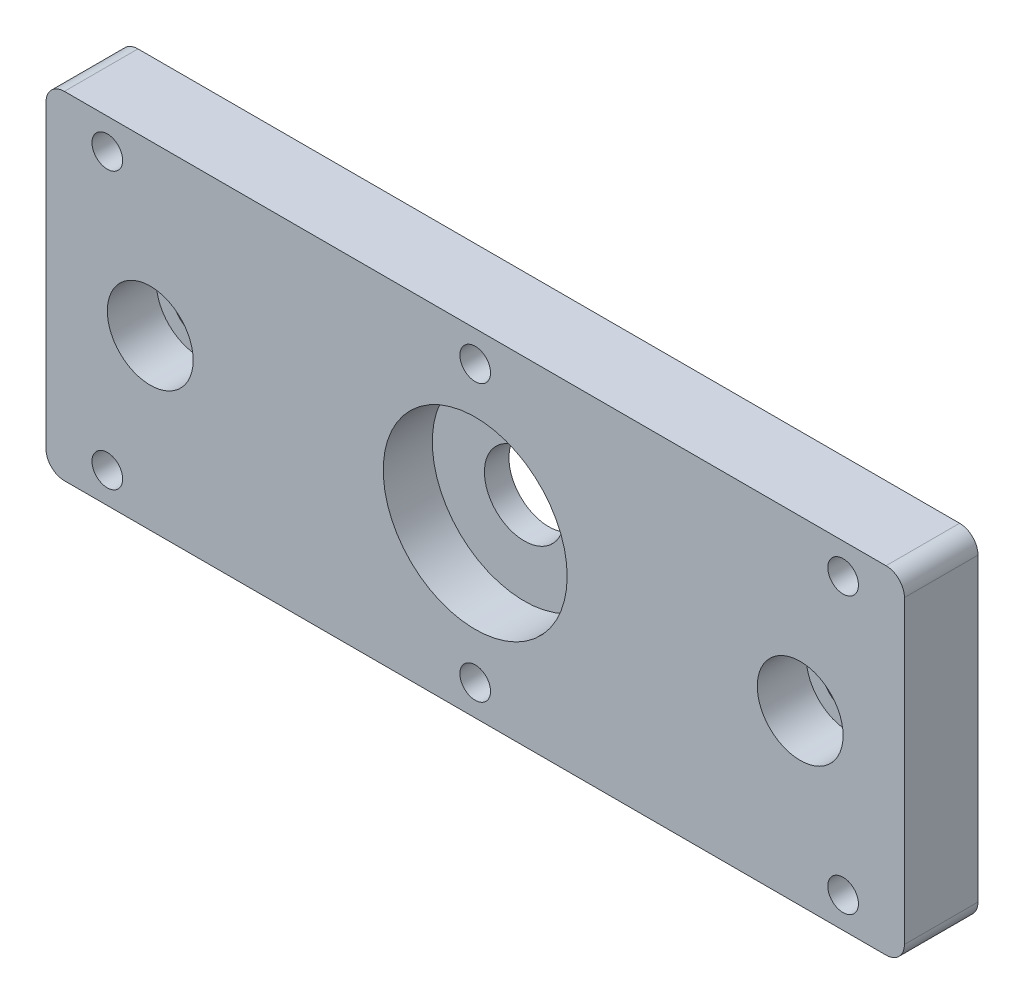
ISO-10303-21;
HEADER;
FILE_DESCRIPTION(('STEP AP214'),'2;1');
FILE_NAME('part.step','',(''),(''),'','','');
FILE_SCHEMA(('AUTOMOTIVE_DESIGN { 1 0 10303 214 1 1 1 1 }'));
ENDSEC;
DATA;
#1=APPLICATION_CONTEXT('core data for automotive mechanical design processes');
#2=APPLICATION_PROTOCOL_DEFINITION('international standard','automotive_design',2000,#1);
#3=PRODUCT_CONTEXT('',#1,'mechanical');
#4=PRODUCT('Part','Part','',(#3));
#5=PRODUCT_RELATED_PRODUCT_CATEGORY('part','',(#4));
#6=PRODUCT_DEFINITION_FORMATION('','',#4);
#7=PRODUCT_DEFINITION_CONTEXT('part definition',#1,'design');
#8=PRODUCT_DEFINITION('design','',#6,#7);
#9=PRODUCT_DEFINITION_SHAPE('','',#8);
#10=(LENGTH_UNIT() NAMED_UNIT(*) SI_UNIT(.MILLI.,.METRE.));
#11=(NAMED_UNIT(*) PLANE_ANGLE_UNIT() SI_UNIT($,.RADIAN.));
#12=(NAMED_UNIT(*) SI_UNIT($,.STERADIAN.) SOLID_ANGLE_UNIT());
#13=UNCERTAINTY_MEASURE_WITH_UNIT(LENGTH_MEASURE(1.E-05),#10,'distance_accuracy_value','');
#14=(GEOMETRIC_REPRESENTATION_CONTEXT(3) GLOBAL_UNCERTAINTY_ASSIGNED_CONTEXT((#13)) GLOBAL_UNIT_ASSIGNED_CONTEXT((#10,
#11,#12)) REPRESENTATION_CONTEXT('',''));
#15=CARTESIAN_POINT('',(0.,0.,0.));
#16=DIRECTION('',(0.,0.,1.));
#17=DIRECTION('',(1.,0.,0.));
#18=AXIS2_PLACEMENT_3D('',#15,#16,#17);
#19=CARTESIAN_POINT('',(0.,0.,0.));
#20=DIRECTION('',(0.,0.,-1.));
#21=DIRECTION('',(-1.,0.,0.));
#22=AXIS2_PLACEMENT_3D('',#19,#20,#21);
#23=PLANE('',#22);
#24=CARTESIAN_POINT('',(-60.,22.5,0.));
#25=DIRECTION('',(0.,0.,1.));
#26=DIRECTION('',(1.,0.,0.));
#27=AXIS2_PLACEMENT_3D('',#24,#25,#26);
#28=CIRCLE('',#27,2.5);
#29=CARTESIAN_POINT('',(-57.5,22.5,0.));
#30=VERTEX_POINT('',#29);
#31=EDGE_CURVE('E426',#30,#30,#28,.T.);
#32=ORIENTED_EDGE('',*,*,#31,.T.);
#33=EDGE_LOOP('',(#32));
#34=FACE_BOUND('',#33,.T.);
#35=CARTESIAN_POINT('',(-60.,-22.5,0.));
#36=DIRECTION('',(0.,0.,1.));
#37=DIRECTION('',(1.,0.,0.));
#38=AXIS2_PLACEMENT_3D('',#35,#36,#37);
#39=CIRCLE('',#38,2.5);
#40=CARTESIAN_POINT('',(-57.5,-22.5,0.));
#41=VERTEX_POINT('',#40);
#42=EDGE_CURVE('E436',#41,#41,#39,.T.);
#43=ORIENTED_EDGE('',*,*,#42,.T.);
#44=EDGE_LOOP('',(#43));
#45=FACE_BOUND('',#44,.T.);
#46=CARTESIAN_POINT('',(0.,-22.5,0.));
#47=DIRECTION('',(0.,0.,1.));
#48=DIRECTION('',(1.,0.,0.));
#49=AXIS2_PLACEMENT_3D('',#46,#47,#48);
#50=CIRCLE('',#49,2.5);
#51=CARTESIAN_POINT('',(2.49999999999998,-22.5,0.));
#52=VERTEX_POINT('',#51);
#53=EDGE_CURVE('E442',#52,#52,#50,.T.);
#54=ORIENTED_EDGE('',*,*,#53,.T.);
#55=EDGE_LOOP('',(#54));
#56=FACE_BOUND('',#55,.T.);
#57=CARTESIAN_POINT('',(0.,22.5,0.));
#58=DIRECTION('',(0.,0.,1.));
#59=DIRECTION('',(1.,0.,0.));
#60=AXIS2_PLACEMENT_3D('',#57,#58,#59);
#61=CIRCLE('',#60,2.5);
#62=CARTESIAN_POINT('',(2.49999999999998,22.5,0.));
#63=VERTEX_POINT('',#62);
#64=EDGE_CURVE('E448',#63,#63,#61,.T.);
#65=ORIENTED_EDGE('',*,*,#64,.T.);
#66=EDGE_LOOP('',(#65));
#67=FACE_BOUND('',#66,.T.);
#68=CARTESIAN_POINT('',(60.,22.5,0.));
#69=DIRECTION('',(0.,0.,1.));
#70=DIRECTION('',(1.,0.,0.));
#71=AXIS2_PLACEMENT_3D('',#68,#69,#70);
#72=CIRCLE('',#71,2.5);
#73=CARTESIAN_POINT('',(62.5,22.5,0.));
#74=VERTEX_POINT('',#73);
#75=EDGE_CURVE('E454',#74,#74,#72,.T.);
#76=ORIENTED_EDGE('',*,*,#75,.T.);
#77=EDGE_LOOP('',(#76));
#78=FACE_BOUND('',#77,.T.);
#79=DIRECTION('',(-1.,0.,0.));
#80=VECTOR('',#79,1.);
#81=CARTESIAN_POINT('',(-70.,27.5,0.));
#82=LINE('',#81,#80);
#83=CARTESIAN_POINT('',(67.,27.5,0.));
#84=VERTEX_POINT('',#83);
#85=CARTESIAN_POINT('',(-67.,27.5,0.));
#86=VERTEX_POINT('',#85);
#87=EDGE_CURVE('E122',#84,#86,#82,.T.);
#88=ORIENTED_EDGE('',*,*,#87,.F.);
#89=CARTESIAN_POINT('',(67.,24.5,0.));
#90=DIRECTION('',(0.,0.,-1.));
#91=DIRECTION('',(-1.,0.,0.));
#92=AXIS2_PLACEMENT_3D('',#89,#90,#91);
#93=CIRCLE('',#92,3.);
#94=CARTESIAN_POINT('',(70.,24.5,0.));
#95=VERTEX_POINT('',#94);
#96=EDGE_CURVE('E105',#84,#95,#93,.T.);
#97=ORIENTED_EDGE('',*,*,#96,.T.);
#98=DIRECTION('',(0.,1.,0.));
#99=VECTOR('',#98,1.);
#100=CARTESIAN_POINT('',(70.,-27.5,0.));
#101=LINE('',#100,#99);
#102=CARTESIAN_POINT('',(70.,-24.5,0.));
#103=VERTEX_POINT('',#102);
#104=EDGE_CURVE('E132',#103,#95,#101,.T.);
#105=ORIENTED_EDGE('',*,*,#104,.F.);
#106=CARTESIAN_POINT('',(67.,-24.5,0.));
#107=DIRECTION('',(0.,0.,-1.));
#108=DIRECTION('',(-1.,0.,0.));
#109=AXIS2_PLACEMENT_3D('',#106,#107,#108);
#110=CIRCLE('',#109,3.);
#111=CARTESIAN_POINT('',(67.,-27.5,0.));
#112=VERTEX_POINT('',#111);
#113=EDGE_CURVE('E116',#103,#112,#110,.T.);
#114=ORIENTED_EDGE('',*,*,#113,.T.);
#115=DIRECTION('',(1.,0.,0.));
#116=VECTOR('',#115,1.);
#117=CARTESIAN_POINT('',(-70.,-27.5,0.));
#118=LINE('',#117,#116);
#119=CARTESIAN_POINT('',(-67.,-27.5,0.));
#120=VERTEX_POINT('',#119);
#121=EDGE_CURVE('E135',#120,#112,#118,.T.);
#122=ORIENTED_EDGE('',*,*,#121,.F.);
#123=CARTESIAN_POINT('',(-67.,-24.5,0.));
#124=DIRECTION('',(0.,0.,-1.));
#125=DIRECTION('',(-1.,0.,0.));
#126=AXIS2_PLACEMENT_3D('',#123,#124,#125);
#127=CIRCLE('',#126,3.);
#128=CARTESIAN_POINT('',(-70.,-24.5,0.));
#129=VERTEX_POINT('',#128);
#130=EDGE_CURVE('E146',#120,#129,#127,.T.);
#131=ORIENTED_EDGE('',*,*,#130,.T.);
#132=DIRECTION('',(0.,-1.,0.));
#133=VECTOR('',#132,1.);
#134=CARTESIAN_POINT('',(-70.,-27.5,0.));
#135=LINE('',#134,#133);
#136=CARTESIAN_POINT('',(-70.,24.5,0.));
#137=VERTEX_POINT('',#136);
#138=EDGE_CURVE('E131',#137,#129,#135,.T.);
#139=ORIENTED_EDGE('',*,*,#138,.F.);
#140=CARTESIAN_POINT('',(-67.,24.5,0.));
#141=DIRECTION('',(0.,0.,-1.));
#142=DIRECTION('',(-1.,0.,0.));
#143=AXIS2_PLACEMENT_3D('',#140,#141,#142);
#144=CIRCLE('',#143,3.);
#145=EDGE_CURVE('E126',#137,#86,#144,.T.);
#146=ORIENTED_EDGE('',*,*,#145,.T.);
#147=EDGE_LOOP('',(#88,#97,#105,#114,#122,#131,#139,#146));
#148=FACE_BOUND('',#147,.T.);
#149=CARTESIAN_POINT('',(0.,0.,0.));
#150=DIRECTION('',(0.,0.,1.));
#151=DIRECTION('',(1.,0.,0.));
#152=AXIS2_PLACEMENT_3D('',#149,#150,#151);
#153=CIRCLE('',#152,6.5);
#154=CARTESIAN_POINT('',(6.5,0.,0.));
#155=VERTEX_POINT('',#154);
#156=EDGE_CURVE('E137',#155,#155,#153,.T.);
#157=ORIENTED_EDGE('',*,*,#156,.T.);
#158=EDGE_LOOP('',(#157));
#159=FACE_BOUND('',#158,.T.);
#160=CARTESIAN_POINT('',(-53.,0.,0.));
#161=DIRECTION('',(0.,0.,1.));
#162=DIRECTION('',(1.,0.,0.));
#163=AXIS2_PLACEMENT_3D('',#160,#161,#162);
#164=CIRCLE('',#163,4.5);
#165=CARTESIAN_POINT('',(-48.5,0.,0.));
#166=VERTEX_POINT('',#165);
#167=EDGE_CURVE('E174',#166,#166,#164,.T.);
#168=ORIENTED_EDGE('',*,*,#167,.T.);
#169=EDGE_LOOP('',(#168));
#170=FACE_BOUND('',#169,.T.);
#171=CARTESIAN_POINT('',(53.,0.,0.));
#172=DIRECTION('',(0.,0.,1.));
#173=DIRECTION('',(1.,0.,0.));
#174=AXIS2_PLACEMENT_3D('',#171,#172,#173);
#175=CIRCLE('',#174,4.5);
#176=CARTESIAN_POINT('',(57.5,0.,0.));
#177=VERTEX_POINT('',#176);
#178=EDGE_CURVE('E170',#177,#177,#175,.T.);
#179=ORIENTED_EDGE('',*,*,#178,.T.);
#180=EDGE_LOOP('',(#179));
#181=FACE_BOUND('',#180,.T.);
#182=CARTESIAN_POINT('',(60.,-22.5,0.));
#183=DIRECTION('',(0.,0.,1.));
#184=DIRECTION('',(1.,0.,0.));
#185=AXIS2_PLACEMENT_3D('',#182,#183,#184);
#186=CIRCLE('',#185,2.5);
#187=CARTESIAN_POINT('',(62.5,-22.5,0.));
#188=VERTEX_POINT('',#187);
#189=EDGE_CURVE('E460',#188,#188,#186,.T.);
#190=ORIENTED_EDGE('',*,*,#189,.T.);
#191=EDGE_LOOP('',(#190));
#192=FACE_BOUND('',#191,.T.);
#193=ADVANCED_FACE('F37',(#34,#45,#56,#67,#78,#148,#159,#170,#181,#192),#23,.T.);
#194=CARTESIAN_POINT('',(0.,0.,0.));
#195=DIRECTION('',(0.,0.,1.));
#196=DIRECTION('',(1.,0.,0.));
#197=AXIS2_PLACEMENT_3D('',#194,#195,#196);
#198=CYLINDRICAL_SURFACE('',#197,6.5);
#199=ORIENTED_EDGE('',*,*,#156,.F.);
#200=EDGE_LOOP('',(#199));
#201=FACE_BOUND('',#200,.T.);
#202=CARTESIAN_POINT('',(0.,0.,4.));
#203=DIRECTION('',(0.,0.,1.));
#204=DIRECTION('',(1.,0.,0.));
#205=AXIS2_PLACEMENT_3D('',#202,#203,#204);
#206=CIRCLE('',#205,6.5);
#207=CARTESIAN_POINT('',(6.5,0.,4.));
#208=VERTEX_POINT('',#207);
#209=EDGE_CURVE('E41',#208,#208,#206,.F.);
#210=ORIENTED_EDGE('',*,*,#209,.F.);
#211=EDGE_LOOP('',(#210));
#212=FACE_BOUND('',#211,.T.);
#213=ADVANCED_FACE('F218',(#201,#212),#198,.F.);
#214=CARTESIAN_POINT('',(-53.,0.,0.));
#215=DIRECTION('',(0.,0.,1.));
#216=DIRECTION('',(1.,0.,0.));
#217=AXIS2_PLACEMENT_3D('',#214,#215,#216);
#218=CYLINDRICAL_SURFACE('',#217,4.5);
#219=ORIENTED_EDGE('',*,*,#167,.F.);
#220=EDGE_LOOP('',(#219));
#221=FACE_BOUND('',#220,.T.);
#222=CARTESIAN_POINT('',(-53.,0.,4.));
#223=DIRECTION('',(0.,0.,1.));
#224=DIRECTION('',(1.,0.,0.));
#225=AXIS2_PLACEMENT_3D('',#222,#223,#224);
#226=CIRCLE('',#225,4.5);
#227=CARTESIAN_POINT('',(-48.5,0.,4.));
#228=VERTEX_POINT('',#227);
#229=EDGE_CURVE('E167',#228,#228,#226,.F.);
#230=ORIENTED_EDGE('',*,*,#229,.F.);
#231=EDGE_LOOP('',(#230));
#232=FACE_BOUND('',#231,.T.);
#233=ADVANCED_FACE('F224',(#221,#232),#218,.F.);
#234=CARTESIAN_POINT('',(53.,0.,0.));
#235=DIRECTION('',(0.,0.,1.));
#236=DIRECTION('',(1.,0.,0.));
#237=AXIS2_PLACEMENT_3D('',#234,#235,#236);
#238=CYLINDRICAL_SURFACE('',#237,4.5);
#239=ORIENTED_EDGE('',*,*,#178,.F.);
#240=EDGE_LOOP('',(#239));
#241=FACE_BOUND('',#240,.T.);
#242=CARTESIAN_POINT('',(53.,0.,4.));
#243=DIRECTION('',(0.,0.,1.));
#244=DIRECTION('',(1.,0.,0.));
#245=AXIS2_PLACEMENT_3D('',#242,#243,#244);
#246=CIRCLE('',#245,4.5);
#247=CARTESIAN_POINT('',(57.5,0.,4.));
#248=VERTEX_POINT('',#247);
#249=EDGE_CURVE('E165',#248,#248,#246,.F.);
#250=ORIENTED_EDGE('',*,*,#249,.F.);
#251=EDGE_LOOP('',(#250));
#252=FACE_BOUND('',#251,.T.);
#253=ADVANCED_FACE('F239',(#241,#252),#238,.F.);
#254=CARTESIAN_POINT('',(70.,-27.5,12.));
#255=DIRECTION('',(-1.,0.,0.));
#256=DIRECTION('',(0.,0.,1.));
#257=AXIS2_PLACEMENT_3D('',#254,#255,#256);
#258=PLANE('',#257);
#259=ORIENTED_EDGE('',*,*,#104,.T.);
#260=DIRECTION('',(0.,0.,-1.));
#261=VECTOR('',#260,1.);
#262=CARTESIAN_POINT('',(70.,24.5,12.));
#263=LINE('',#262,#261);
#264=CARTESIAN_POINT('',(70.,24.5,12.));
#265=VERTEX_POINT('',#264);
#266=EDGE_CURVE('E110',#95,#265,#263,.F.);
#267=ORIENTED_EDGE('',*,*,#266,.T.);
#268=DIRECTION('',(0.,1.,0.));
#269=VECTOR('',#268,1.);
#270=CARTESIAN_POINT('',(70.,-27.5,12.));
#271=LINE('',#270,#269);
#272=CARTESIAN_POINT('',(70.,-24.5,12.));
#273=VERTEX_POINT('',#272);
#274=EDGE_CURVE('E142',#273,#265,#271,.T.);
#275=ORIENTED_EDGE('',*,*,#274,.F.);
#276=DIRECTION('',(0.,0.,-1.));
#277=VECTOR('',#276,1.);
#278=CARTESIAN_POINT('',(70.,-24.5,12.));
#279=LINE('',#278,#277);
#280=EDGE_CURVE('E115',#273,#103,#279,.T.);
#281=ORIENTED_EDGE('',*,*,#280,.T.);
#282=EDGE_LOOP('',(#259,#267,#275,#281));
#283=FACE_BOUND('',#282,.T.);
#284=ADVANCED_FACE('F196',(#283),#258,.F.);
#285=CARTESIAN_POINT('',(-70.,27.5,12.));
#286=DIRECTION('',(0.,-1.,0.));
#287=DIRECTION('',(0.,0.,-1.));
#288=AXIS2_PLACEMENT_3D('',#285,#286,#287);
#289=PLANE('',#288);
#290=DIRECTION('',(-1.,0.,0.));
#291=VECTOR('',#290,1.);
#292=CARTESIAN_POINT('',(-70.,27.5,12.));
#293=LINE('',#292,#291);
#294=CARTESIAN_POINT('',(67.,27.5,12.));
#295=VERTEX_POINT('',#294);
#296=CARTESIAN_POINT('',(-67.,27.5,12.));
#297=VERTEX_POINT('',#296);
#298=EDGE_CURVE('E125',#295,#297,#293,.T.);
#299=ORIENTED_EDGE('',*,*,#298,.F.);
#300=DIRECTION('',(0.,0.,-1.));
#301=VECTOR('',#300,1.);
#302=CARTESIAN_POINT('',(67.,27.5,12.));
#303=LINE('',#302,#301);
#304=EDGE_CURVE('E109',#295,#84,#303,.T.);
#305=ORIENTED_EDGE('',*,*,#304,.T.);
#306=ORIENTED_EDGE('',*,*,#87,.T.);
#307=DIRECTION('',(0.,0.,-1.));
#308=VECTOR('',#307,1.);
#309=CARTESIAN_POINT('',(-67.,27.5,12.));
#310=LINE('',#309,#308);
#311=EDGE_CURVE('E127',#86,#297,#310,.F.);
#312=ORIENTED_EDGE('',*,*,#311,.T.);
#313=EDGE_LOOP('',(#299,#305,#306,#312));
#314=FACE_BOUND('',#313,.T.);
#315=ADVANCED_FACE('F121',(#314),#289,.F.);
#316=CARTESIAN_POINT('',(-70.,-27.5,12.));
#317=DIRECTION('',(1.,0.,0.));
#318=DIRECTION('',(0.,0.,-1.));
#319=AXIS2_PLACEMENT_3D('',#316,#317,#318);
#320=PLANE('',#319);
#321=ORIENTED_EDGE('',*,*,#138,.T.);
#322=DIRECTION('',(0.,0.,-1.));
#323=VECTOR('',#322,1.);
#324=CARTESIAN_POINT('',(-70.,-24.5,12.));
#325=LINE('',#324,#323);
#326=CARTESIAN_POINT('',(-70.,-24.5,12.));
#327=VERTEX_POINT('',#326);
#328=EDGE_CURVE('E11',#129,#327,#325,.F.);
#329=ORIENTED_EDGE('',*,*,#328,.T.);
#330=DIRECTION('',(0.,-1.,0.));
#331=VECTOR('',#330,1.);
#332=CARTESIAN_POINT('',(-70.,-27.5,12.));
#333=LINE('',#332,#331);
#334=CARTESIAN_POINT('',(-70.,24.5,12.));
#335=VERTEX_POINT('',#334);
#336=EDGE_CURVE('E187',#335,#327,#333,.T.);
#337=ORIENTED_EDGE('',*,*,#336,.F.);
#338=DIRECTION('',(0.,0.,-1.));
#339=VECTOR('',#338,1.);
#340=CARTESIAN_POINT('',(-70.,24.5,12.));
#341=LINE('',#340,#339);
#342=EDGE_CURVE('E46',#335,#137,#341,.T.);
#343=ORIENTED_EDGE('',*,*,#342,.T.);
#344=EDGE_LOOP('',(#321,#329,#337,#343));
#345=FACE_BOUND('',#344,.T.);
#346=ADVANCED_FACE('F203',(#345),#320,.F.);
#347=CARTESIAN_POINT('',(-70.,-27.5,12.));
#348=DIRECTION('',(0.,1.,0.));
#349=DIRECTION('',(0.,0.,1.));
#350=AXIS2_PLACEMENT_3D('',#347,#348,#349);
#351=PLANE('',#350);
#352=ORIENTED_EDGE('',*,*,#121,.T.);
#353=DIRECTION('',(0.,0.,-1.));
#354=VECTOR('',#353,1.);
#355=CARTESIAN_POINT('',(67.,-27.5,12.));
#356=LINE('',#355,#354);
#357=CARTESIAN_POINT('',(67.,-27.5,12.));
#358=VERTEX_POINT('',#357);
#359=EDGE_CURVE('E54',#112,#358,#356,.F.);
#360=ORIENTED_EDGE('',*,*,#359,.T.);
#361=DIRECTION('',(1.,0.,0.));
#362=VECTOR('',#361,1.);
#363=CARTESIAN_POINT('',(-70.,-27.5,12.));
#364=LINE('',#363,#362);
#365=CARTESIAN_POINT('',(-67.,-27.5,12.));
#366=VERTEX_POINT('',#365);
#367=EDGE_CURVE('E143',#366,#358,#364,.T.);
#368=ORIENTED_EDGE('',*,*,#367,.F.);
#369=DIRECTION('',(0.,0.,-1.));
#370=VECTOR('',#369,1.);
#371=CARTESIAN_POINT('',(-67.,-27.5,12.));
#372=LINE('',#371,#370);
#373=EDGE_CURVE('E159',#366,#120,#372,.T.);
#374=ORIENTED_EDGE('',*,*,#373,.T.);
#375=EDGE_LOOP('',(#352,#360,#368,#374));
#376=FACE_BOUND('',#375,.T.);
#377=ADVANCED_FACE('F198',(#376),#351,.F.);
#378=CARTESIAN_POINT('',(0.,0.,12.));
#379=DIRECTION('',(0.,0.,-1.));
#380=DIRECTION('',(-1.,0.,0.));
#381=AXIS2_PLACEMENT_3D('',#378,#379,#380);
#382=PLANE('',#381);
#383=CARTESIAN_POINT('',(-60.,22.5,12.));
#384=DIRECTION('',(0.,0.,1.));
#385=DIRECTION('',(1.,0.,0.));
#386=AXIS2_PLACEMENT_3D('',#383,#384,#385);
#387=CIRCLE('',#386,2.5);
#388=CARTESIAN_POINT('',(-57.5,22.5,12.));
#389=VERTEX_POINT('',#388);
#390=EDGE_CURVE('E429',#389,#389,#387,.T.);
#391=ORIENTED_EDGE('',*,*,#390,.F.);
#392=EDGE_LOOP('',(#391));
#393=FACE_BOUND('',#392,.T.);
#394=CARTESIAN_POINT('',(-60.,-22.5,12.));
#395=DIRECTION('',(0.,0.,1.));
#396=DIRECTION('',(1.,0.,0.));
#397=AXIS2_PLACEMENT_3D('',#394,#395,#396);
#398=CIRCLE('',#397,2.5);
#399=CARTESIAN_POINT('',(-57.5,-22.5,12.));
#400=VERTEX_POINT('',#399);
#401=EDGE_CURVE('E431',#400,#400,#398,.T.);
#402=ORIENTED_EDGE('',*,*,#401,.F.);
#403=EDGE_LOOP('',(#402));
#404=FACE_BOUND('',#403,.T.);
#405=CARTESIAN_POINT('',(0.,-22.5,12.));
#406=DIRECTION('',(0.,0.,1.));
#407=DIRECTION('',(1.,0.,0.));
#408=AXIS2_PLACEMENT_3D('',#405,#406,#407);
#409=CIRCLE('',#408,2.5);
#410=CARTESIAN_POINT('',(2.49999999999998,-22.5,12.));
#411=VERTEX_POINT('',#410);
#412=EDGE_CURVE('E439',#411,#411,#409,.T.);
#413=ORIENTED_EDGE('',*,*,#412,.F.);
#414=EDGE_LOOP('',(#413));
#415=FACE_BOUND('',#414,.T.);
#416=CARTESIAN_POINT('',(0.,22.5,12.));
#417=DIRECTION('',(0.,0.,1.));
#418=DIRECTION('',(1.,0.,0.));
#419=AXIS2_PLACEMENT_3D('',#416,#417,#418);
#420=CIRCLE('',#419,2.5);
#421=CARTESIAN_POINT('',(2.49999999999998,22.5,12.));
#422=VERTEX_POINT('',#421);
#423=EDGE_CURVE('E445',#422,#422,#420,.T.);
#424=ORIENTED_EDGE('',*,*,#423,.F.);
#425=EDGE_LOOP('',(#424));
#426=FACE_BOUND('',#425,.T.);
#427=CARTESIAN_POINT('',(60.,22.5,12.));
#428=DIRECTION('',(0.,0.,1.));
#429=DIRECTION('',(1.,0.,0.));
#430=AXIS2_PLACEMENT_3D('',#427,#428,#429);
#431=CIRCLE('',#430,2.5);
#432=CARTESIAN_POINT('',(62.5,22.5,12.));
#433=VERTEX_POINT('',#432);
#434=EDGE_CURVE('E451',#433,#433,#431,.T.);
#435=ORIENTED_EDGE('',*,*,#434,.F.);
#436=EDGE_LOOP('',(#435));
#437=FACE_BOUND('',#436,.T.);
#438=CARTESIAN_POINT('',(60.,-22.5,12.));
#439=DIRECTION('',(0.,0.,1.));
#440=DIRECTION('',(1.,0.,0.));
#441=AXIS2_PLACEMENT_3D('',#438,#439,#440);
#442=CIRCLE('',#441,2.5);
#443=CARTESIAN_POINT('',(62.5,-22.5,12.));
#444=VERTEX_POINT('',#443);
#445=EDGE_CURVE('E457',#444,#444,#442,.T.);
#446=ORIENTED_EDGE('',*,*,#445,.F.);
#447=EDGE_LOOP('',(#446));
#448=FACE_BOUND('',#447,.T.);
#449=CARTESIAN_POINT('',(0.,0.,12.));
#450=DIRECTION('',(0.,0.,1.));
#451=DIRECTION('',(1.,0.,0.));
#452=AXIS2_PLACEMENT_3D('',#449,#450,#451);
#453=CIRCLE('',#452,15.);
#454=CARTESIAN_POINT('',(15.,0.,12.));
#455=VERTEX_POINT('',#454);
#456=EDGE_CURVE('E463',#455,#455,#453,.T.);
#457=ORIENTED_EDGE('',*,*,#456,.F.);
#458=EDGE_LOOP('',(#457));
#459=FACE_BOUND('',#458,.T.);
#460=CARTESIAN_POINT('',(-53.,0.,12.));
#461=DIRECTION('',(0.,0.,1.));
#462=DIRECTION('',(1.,0.,0.));
#463=AXIS2_PLACEMENT_3D('',#460,#461,#462);
#464=CIRCLE('',#463,7.);
#465=CARTESIAN_POINT('',(-46.,0.,12.));
#466=VERTEX_POINT('',#465);
#467=EDGE_CURVE('E471',#466,#466,#464,.T.);
#468=ORIENTED_EDGE('',*,*,#467,.F.);
#469=EDGE_LOOP('',(#468));
#470=FACE_BOUND('',#469,.T.);
#471=CARTESIAN_POINT('',(53.,0.,12.));
#472=DIRECTION('',(0.,0.,1.));
#473=DIRECTION('',(1.,0.,0.));
#474=AXIS2_PLACEMENT_3D('',#471,#472,#473);
#475=CIRCLE('',#474,7.);
#476=CARTESIAN_POINT('',(60.,0.,12.));
#477=VERTEX_POINT('',#476);
#478=EDGE_CURVE('E476',#477,#477,#475,.T.);
#479=ORIENTED_EDGE('',*,*,#478,.F.);
#480=EDGE_LOOP('',(#479));
#481=FACE_BOUND('',#480,.T.);
#482=ORIENTED_EDGE('',*,*,#274,.T.);
#483=CARTESIAN_POINT('',(67.,24.5,12.));
#484=DIRECTION('',(0.,0.,-1.));
#485=DIRECTION('',(-1.,0.,0.));
#486=AXIS2_PLACEMENT_3D('',#483,#484,#485);
#487=CIRCLE('',#486,3.);
#488=EDGE_CURVE('E157',#265,#295,#487,.F.);
#489=ORIENTED_EDGE('',*,*,#488,.T.);
#490=ORIENTED_EDGE('',*,*,#298,.T.);
#491=CARTESIAN_POINT('',(-67.,24.5,12.));
#492=DIRECTION('',(0.,0.,-1.));
#493=DIRECTION('',(-1.,0.,0.));
#494=AXIS2_PLACEMENT_3D('',#491,#492,#493);
#495=CIRCLE('',#494,3.);
#496=EDGE_CURVE('E152',#297,#335,#495,.F.);
#497=ORIENTED_EDGE('',*,*,#496,.T.);
#498=ORIENTED_EDGE('',*,*,#336,.T.);
#499=CARTESIAN_POINT('',(-67.,-24.5,12.));
#500=DIRECTION('',(0.,0.,-1.));
#501=DIRECTION('',(-1.,0.,0.));
#502=AXIS2_PLACEMENT_3D('',#499,#500,#501);
#503=CIRCLE('',#502,3.);
#504=EDGE_CURVE('E61',#327,#366,#503,.F.);
#505=ORIENTED_EDGE('',*,*,#504,.T.);
#506=ORIENTED_EDGE('',*,*,#367,.T.);
#507=CARTESIAN_POINT('',(67.,-24.5,12.));
#508=DIRECTION('',(0.,0.,-1.));
#509=DIRECTION('',(-1.,0.,0.));
#510=AXIS2_PLACEMENT_3D('',#507,#508,#509);
#511=CIRCLE('',#510,3.);
#512=EDGE_CURVE('E155',#358,#273,#511,.F.);
#513=ORIENTED_EDGE('',*,*,#512,.T.);
#514=EDGE_LOOP('',(#482,#489,#490,#497,#498,#505,#506,#513));
#515=FACE_BOUND('',#514,.T.);
#516=ADVANCED_FACE('F189',(#393,#404,#415,#426,#437,#448,#459,#470,#481,#515),#382,.F.);
#517=CARTESIAN_POINT('',(67.,24.5,12.));
#518=DIRECTION('',(0.,0.,-1.));
#519=DIRECTION('',(-1.,0.,0.));
#520=AXIS2_PLACEMENT_3D('',#517,#518,#519);
#521=CYLINDRICAL_SURFACE('',#520,3.);
#522=ORIENTED_EDGE('',*,*,#488,.F.);
#523=ORIENTED_EDGE('',*,*,#266,.F.);
#524=ORIENTED_EDGE('',*,*,#96,.F.);
#525=ORIENTED_EDGE('',*,*,#304,.F.);
#526=EDGE_LOOP('',(#522,#523,#524,#525));
#527=FACE_BOUND('',#526,.T.);
#528=ADVANCED_FACE('F108',(#527),#521,.T.);
#529=CARTESIAN_POINT('',(67.,-24.5,12.));
#530=DIRECTION('',(0.,0.,-1.));
#531=DIRECTION('',(-1.,0.,0.));
#532=AXIS2_PLACEMENT_3D('',#529,#530,#531);
#533=CYLINDRICAL_SURFACE('',#532,3.);
#534=ORIENTED_EDGE('',*,*,#512,.F.);
#535=ORIENTED_EDGE('',*,*,#359,.F.);
#536=ORIENTED_EDGE('',*,*,#113,.F.);
#537=ORIENTED_EDGE('',*,*,#280,.F.);
#538=EDGE_LOOP('',(#534,#535,#536,#537));
#539=FACE_BOUND('',#538,.T.);
#540=ADVANCED_FACE('F194',(#539),#533,.T.);
#541=CARTESIAN_POINT('',(-67.,-24.5,12.));
#542=DIRECTION('',(0.,0.,-1.));
#543=DIRECTION('',(-1.,0.,0.));
#544=AXIS2_PLACEMENT_3D('',#541,#542,#543);
#545=CYLINDRICAL_SURFACE('',#544,3.);
#546=ORIENTED_EDGE('',*,*,#504,.F.);
#547=ORIENTED_EDGE('',*,*,#328,.F.);
#548=ORIENTED_EDGE('',*,*,#130,.F.);
#549=ORIENTED_EDGE('',*,*,#373,.F.);
#550=EDGE_LOOP('',(#546,#547,#548,#549));
#551=FACE_BOUND('',#550,.T.);
#552=ADVANCED_FACE('F200',(#551),#545,.T.);
#553=CARTESIAN_POINT('',(-67.,24.5,12.));
#554=DIRECTION('',(0.,0.,-1.));
#555=DIRECTION('',(-1.,0.,0.));
#556=AXIS2_PLACEMENT_3D('',#553,#554,#555);
#557=CYLINDRICAL_SURFACE('',#556,3.);
#558=ORIENTED_EDGE('',*,*,#496,.F.);
#559=ORIENTED_EDGE('',*,*,#311,.F.);
#560=ORIENTED_EDGE('',*,*,#145,.F.);
#561=ORIENTED_EDGE('',*,*,#342,.F.);
#562=EDGE_LOOP('',(#558,#559,#560,#561));
#563=FACE_BOUND('',#562,.T.);
#564=ADVANCED_FACE('F39',(#563),#557,.T.);
#565=CARTESIAN_POINT('',(53.,0.,4.));
#566=DIRECTION('',(0.,0.,1.));
#567=DIRECTION('',(1.,0.,0.));
#568=AXIS2_PLACEMENT_3D('',#565,#566,#567);
#569=PLANE('',#568);
#570=CARTESIAN_POINT('',(53.,0.,4.));
#571=DIRECTION('',(0.,0.,1.));
#572=DIRECTION('',(1.,0.,0.));
#573=AXIS2_PLACEMENT_3D('',#570,#571,#572);
#574=CIRCLE('',#573,7.);
#575=CARTESIAN_POINT('',(60.,0.,4.));
#576=VERTEX_POINT('',#575);
#577=EDGE_CURVE('E474',#576,#576,#574,.T.);
#578=ORIENTED_EDGE('',*,*,#577,.T.);
#579=EDGE_LOOP('',(#578));
#580=FACE_BOUND('',#579,.T.);
#581=ORIENTED_EDGE('',*,*,#249,.T.);
#582=EDGE_LOOP('',(#581));
#583=FACE_BOUND('',#582,.T.);
#584=ADVANCED_FACE('F209',(#580,#583),#569,.T.);
#585=CARTESIAN_POINT('',(53.,0.,4.));
#586=DIRECTION('',(0.,0.,1.));
#587=DIRECTION('',(1.,0.,0.));
#588=AXIS2_PLACEMENT_3D('',#585,#586,#587);
#589=CYLINDRICAL_SURFACE('',#588,7.);
#590=ORIENTED_EDGE('',*,*,#577,.F.);
#591=EDGE_LOOP('',(#590));
#592=FACE_BOUND('',#591,.T.);
#593=ORIENTED_EDGE('',*,*,#478,.T.);
#594=EDGE_LOOP('',(#593));
#595=FACE_BOUND('',#594,.T.);
#596=ADVANCED_FACE('F214',(#592,#595),#589,.F.);
#597=CARTESIAN_POINT('',(-53.,0.,4.));
#598=DIRECTION('',(0.,0.,1.));
#599=DIRECTION('',(1.,0.,0.));
#600=AXIS2_PLACEMENT_3D('',#597,#598,#599);
#601=PLANE('',#600);
#602=CARTESIAN_POINT('',(-53.,0.,4.));
#603=DIRECTION('',(0.,0.,1.));
#604=DIRECTION('',(1.,0.,0.));
#605=AXIS2_PLACEMENT_3D('',#602,#603,#604);
#606=CIRCLE('',#605,7.);
#607=CARTESIAN_POINT('',(-46.,0.,4.));
#608=VERTEX_POINT('',#607);
#609=EDGE_CURVE('E168',#608,#608,#606,.T.);
#610=ORIENTED_EDGE('',*,*,#609,.T.);
#611=EDGE_LOOP('',(#610));
#612=FACE_BOUND('',#611,.T.);
#613=ORIENTED_EDGE('',*,*,#229,.T.);
#614=EDGE_LOOP('',(#613));
#615=FACE_BOUND('',#614,.T.);
#616=ADVANCED_FACE('F289',(#612,#615),#601,.T.);
#617=CARTESIAN_POINT('',(-53.,0.,4.));
#618=DIRECTION('',(0.,0.,1.));
#619=DIRECTION('',(1.,0.,0.));
#620=AXIS2_PLACEMENT_3D('',#617,#618,#619);
#621=CYLINDRICAL_SURFACE('',#620,7.);
#622=ORIENTED_EDGE('',*,*,#609,.F.);
#623=EDGE_LOOP('',(#622));
#624=FACE_BOUND('',#623,.T.);
#625=ORIENTED_EDGE('',*,*,#467,.T.);
#626=EDGE_LOOP('',(#625));
#627=FACE_BOUND('',#626,.T.);
#628=ADVANCED_FACE('F299',(#624,#627),#621,.F.);
#629=CARTESIAN_POINT('',(0.,0.,4.));
#630=DIRECTION('',(0.,0.,1.));
#631=DIRECTION('',(1.,0.,0.));
#632=AXIS2_PLACEMENT_3D('',#629,#630,#631);
#633=PLANE('',#632);
#634=CARTESIAN_POINT('',(0.,0.,4.));
#635=DIRECTION('',(0.,0.,1.));
#636=DIRECTION('',(1.,0.,0.));
#637=AXIS2_PLACEMENT_3D('',#634,#635,#636);
#638=CIRCLE('',#637,15.);
#639=CARTESIAN_POINT('',(15.,0.,4.));
#640=VERTEX_POINT('',#639);
#641=EDGE_CURVE('E464',#640,#640,#638,.T.);
#642=ORIENTED_EDGE('',*,*,#641,.T.);
#643=EDGE_LOOP('',(#642));
#644=FACE_BOUND('',#643,.T.);
#645=ORIENTED_EDGE('',*,*,#209,.T.);
#646=EDGE_LOOP('',(#645));
#647=FACE_BOUND('',#646,.T.);
#648=ADVANCED_FACE('F309',(#644,#647),#633,.T.);
#649=CARTESIAN_POINT('',(0.,0.,4.));
#650=DIRECTION('',(0.,0.,1.));
#651=DIRECTION('',(1.,0.,0.));
#652=AXIS2_PLACEMENT_3D('',#649,#650,#651);
#653=CYLINDRICAL_SURFACE('',#652,15.);
#654=ORIENTED_EDGE('',*,*,#641,.F.);
#655=EDGE_LOOP('',(#654));
#656=FACE_BOUND('',#655,.T.);
#657=ORIENTED_EDGE('',*,*,#456,.T.);
#658=EDGE_LOOP('',(#657));
#659=FACE_BOUND('',#658,.T.);
#660=ADVANCED_FACE('F325',(#656,#659),#653,.F.);
#661=CARTESIAN_POINT('',(60.,-22.5,12.));
#662=DIRECTION('',(0.,0.,1.));
#663=DIRECTION('',(1.,0.,0.));
#664=AXIS2_PLACEMENT_3D('',#661,#662,#663);
#665=CYLINDRICAL_SURFACE('',#664,2.5);
#666=ORIENTED_EDGE('',*,*,#189,.F.);
#667=EDGE_LOOP('',(#666));
#668=FACE_BOUND('',#667,.T.);
#669=ORIENTED_EDGE('',*,*,#445,.T.);
#670=EDGE_LOOP('',(#669));
#671=FACE_BOUND('',#670,.T.);
#672=ADVANCED_FACE('F334',(#668,#671),#665,.F.);
#673=CARTESIAN_POINT('',(60.,22.5,12.));
#674=DIRECTION('',(0.,0.,1.));
#675=DIRECTION('',(1.,0.,0.));
#676=AXIS2_PLACEMENT_3D('',#673,#674,#675);
#677=CYLINDRICAL_SURFACE('',#676,2.5);
#678=ORIENTED_EDGE('',*,*,#75,.F.);
#679=EDGE_LOOP('',(#678));
#680=FACE_BOUND('',#679,.T.);
#681=ORIENTED_EDGE('',*,*,#434,.T.);
#682=EDGE_LOOP('',(#681));
#683=FACE_BOUND('',#682,.T.);
#684=ADVANCED_FACE('F359',(#680,#683),#677,.F.);
#685=CARTESIAN_POINT('',(0.,22.5,12.));
#686=DIRECTION('',(0.,0.,1.));
#687=DIRECTION('',(1.,0.,0.));
#688=AXIS2_PLACEMENT_3D('',#685,#686,#687);
#689=CYLINDRICAL_SURFACE('',#688,2.5);
#690=ORIENTED_EDGE('',*,*,#64,.F.);
#691=EDGE_LOOP('',(#690));
#692=FACE_BOUND('',#691,.T.);
#693=ORIENTED_EDGE('',*,*,#423,.T.);
#694=EDGE_LOOP('',(#693));
#695=FACE_BOUND('',#694,.T.);
#696=ADVANCED_FACE('F370',(#692,#695),#689,.F.);
#697=CARTESIAN_POINT('',(0.,-22.5,12.));
#698=DIRECTION('',(0.,0.,1.));
#699=DIRECTION('',(1.,0.,0.));
#700=AXIS2_PLACEMENT_3D('',#697,#698,#699);
#701=CYLINDRICAL_SURFACE('',#700,2.5);
#702=ORIENTED_EDGE('',*,*,#53,.F.);
#703=EDGE_LOOP('',(#702));
#704=FACE_BOUND('',#703,.T.);
#705=ORIENTED_EDGE('',*,*,#412,.T.);
#706=EDGE_LOOP('',(#705));
#707=FACE_BOUND('',#706,.T.);
#708=ADVANCED_FACE('F381',(#704,#707),#701,.F.);
#709=CARTESIAN_POINT('',(-60.,-22.5,12.));
#710=DIRECTION('',(0.,0.,1.));
#711=DIRECTION('',(1.,0.,0.));
#712=AXIS2_PLACEMENT_3D('',#709,#710,#711);
#713=CYLINDRICAL_SURFACE('',#712,2.5);
#714=ORIENTED_EDGE('',*,*,#42,.F.);
#715=EDGE_LOOP('',(#714));
#716=FACE_BOUND('',#715,.T.);
#717=ORIENTED_EDGE('',*,*,#401,.T.);
#718=EDGE_LOOP('',(#717));
#719=FACE_BOUND('',#718,.T.);
#720=ADVANCED_FACE('F392',(#716,#719),#713,.F.);
#721=CARTESIAN_POINT('',(-60.,22.5,12.));
#722=DIRECTION('',(0.,0.,1.));
#723=DIRECTION('',(1.,0.,0.));
#724=AXIS2_PLACEMENT_3D('',#721,#722,#723);
#725=CYLINDRICAL_SURFACE('',#724,2.5);
#726=ORIENTED_EDGE('',*,*,#31,.F.);
#727=EDGE_LOOP('',(#726));
#728=FACE_BOUND('',#727,.T.);
#729=ORIENTED_EDGE('',*,*,#390,.T.);
#730=EDGE_LOOP('',(#729));
#731=FACE_BOUND('',#730,.T.);
#732=ADVANCED_FACE('F403',(#728,#731),#725,.F.);
#733=CLOSED_SHELL('',(#193,#213,#233,#253,#284,#315,#346,#377,#516,#528,#540,#552,#564,#584,
#596,#616,#628,#648,#660,#672,#684,#696,#708,#720,#732));
#734=MANIFOLD_SOLID_BREP('B2',#733);
#735=ADVANCED_BREP_SHAPE_REPRESENTATION('',(#18,#734),#14);
#736=SHAPE_DEFINITION_REPRESENTATION(#9,#735);
ENDSEC;
END-ISO-10303-21;
